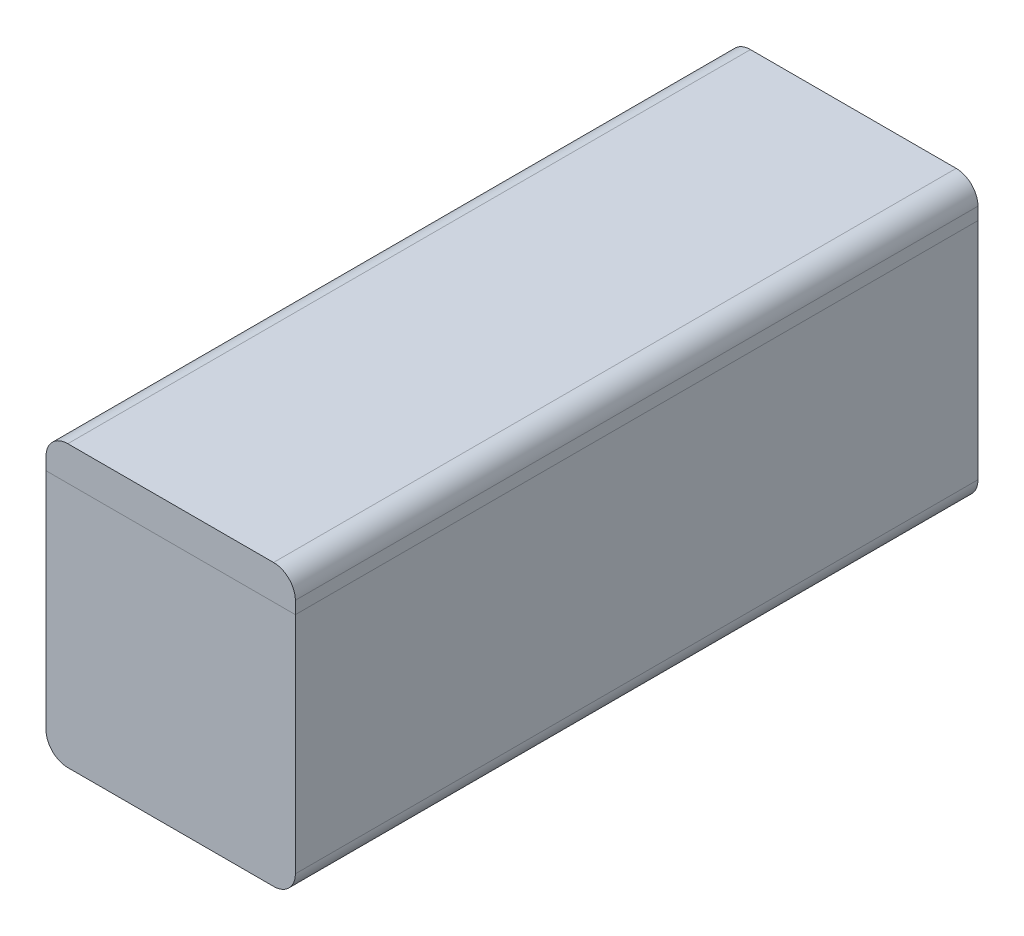
ISO-10303-21;
HEADER;
FILE_DESCRIPTION(('STEP AP214'),'2;1');
FILE_NAME('part.step','',(''),(''),'','','');
FILE_SCHEMA(('AUTOMOTIVE_DESIGN { 1 0 10303 214 1 1 1 1 }'));
ENDSEC;
DATA;
#1=APPLICATION_CONTEXT('core data for automotive mechanical design processes');
#2=APPLICATION_PROTOCOL_DEFINITION('international standard','automotive_design',2000,#1);
#3=PRODUCT_CONTEXT('',#1,'mechanical');
#4=PRODUCT('Part','Part','',(#3));
#5=PRODUCT_RELATED_PRODUCT_CATEGORY('part','',(#4));
#6=PRODUCT_DEFINITION_FORMATION('','',#4);
#7=PRODUCT_DEFINITION_CONTEXT('part definition',#1,'design');
#8=PRODUCT_DEFINITION('design','',#6,#7);
#9=PRODUCT_DEFINITION_SHAPE('','',#8);
#10=(LENGTH_UNIT() NAMED_UNIT(*) SI_UNIT(.MILLI.,.METRE.));
#11=(NAMED_UNIT(*) PLANE_ANGLE_UNIT() SI_UNIT($,.RADIAN.));
#12=(NAMED_UNIT(*) SI_UNIT($,.STERADIAN.) SOLID_ANGLE_UNIT());
#13=UNCERTAINTY_MEASURE_WITH_UNIT(LENGTH_MEASURE(1.E-05),#10,'distance_accuracy_value','');
#14=(GEOMETRIC_REPRESENTATION_CONTEXT(3) GLOBAL_UNCERTAINTY_ASSIGNED_CONTEXT((#13)) GLOBAL_UNIT_ASSIGNED_CONTEXT((#10,
#11,#12)) REPRESENTATION_CONTEXT('',''));
#15=CARTESIAN_POINT('',(0.,0.,0.));
#16=DIRECTION('',(0.,0.,1.));
#17=DIRECTION('',(1.,0.,0.));
#18=AXIS2_PLACEMENT_3D('',#15,#16,#17);
#19=CARTESIAN_POINT('',(0.,79.,-219.01));
#20=DIRECTION('',(0.,-1.,0.));
#21=DIRECTION('',(0.,0.,-1.));
#22=AXIS2_PLACEMENT_3D('',#19,#20,#21);
#23=PLANE('',#22);
#24=DIRECTION('',(0.,0.,-1.));
#25=VECTOR('',#24,1.);
#26=CARTESIAN_POINT('',(78.,79.,-219.));
#27=LINE('',#26,#25);
#28=CARTESIAN_POINT('',(78.,79.,-2.));
#29=VERTEX_POINT('',#28);
#30=CARTESIAN_POINT('',(78.,79.,-217.));
#31=VERTEX_POINT('',#30);
#32=EDGE_CURVE('E165',#29,#31,#27,.T.);
#33=ORIENTED_EDGE('',*,*,#32,.T.);
#34=DIRECTION('',(-1.,0.,0.));
#35=VECTOR('',#34,1.);
#36=CARTESIAN_POINT('',(73.,79.,-217.));
#37=LINE('',#36,#35);
#38=CARTESIAN_POINT('',(2.,79.,-217.));
#39=VERTEX_POINT('',#38);
#40=EDGE_CURVE('E151',#31,#39,#37,.T.);
#41=ORIENTED_EDGE('',*,*,#40,.T.);
#42=DIRECTION('',(0.,0.,1.));
#43=VECTOR('',#42,1.);
#44=CARTESIAN_POINT('',(2.,79.,-219.));
#45=LINE('',#44,#43);
#46=CARTESIAN_POINT('',(2.,79.,-2.));
#47=VERTEX_POINT('',#46);
#48=EDGE_CURVE('E160',#39,#47,#45,.T.);
#49=ORIENTED_EDGE('',*,*,#48,.T.);
#50=DIRECTION('',(-1.,0.,0.));
#51=VECTOR('',#50,1.);
#52=CARTESIAN_POINT('',(73.,79.,-2.));
#53=LINE('',#52,#51);
#54=EDGE_CURVE('E175',#29,#47,#53,.T.);
#55=ORIENTED_EDGE('',*,*,#54,.F.);
#56=EDGE_LOOP('',(#33,#41,#49,#55));
#57=FACE_BOUND('',#56,.T.);
#58=DIRECTION('',(-1.,0.,0.));
#59=VECTOR('',#58,1.);
#60=CARTESIAN_POINT('',(73.,79.,-219.));
#61=LINE('',#60,#59);
#62=CARTESIAN_POINT('',(80.,79.,-219.));
#63=VERTEX_POINT('',#62);
#64=CARTESIAN_POINT('',(0.,79.,-219.));
#65=VERTEX_POINT('',#64);
#66=EDGE_CURVE('E196',#63,#65,#61,.T.);
#67=ORIENTED_EDGE('',*,*,#66,.F.);
#68=DIRECTION('',(0.,0.,-1.));
#69=VECTOR('',#68,1.);
#70=CARTESIAN_POINT('',(80.,79.,-219.));
#71=LINE('',#70,#69);
#72=CARTESIAN_POINT('',(80.,79.,0.));
#73=VERTEX_POINT('',#72);
#74=EDGE_CURVE('E201',#73,#63,#71,.T.);
#75=ORIENTED_EDGE('',*,*,#74,.F.);
#76=DIRECTION('',(-1.,0.,0.));
#77=VECTOR('',#76,1.);
#78=CARTESIAN_POINT('',(73.,79.,0.));
#79=LINE('',#78,#77);
#80=CARTESIAN_POINT('',(0.,79.,0.));
#81=VERTEX_POINT('',#80);
#82=EDGE_CURVE('E204',#73,#81,#79,.T.);
#83=ORIENTED_EDGE('',*,*,#82,.T.);
#84=DIRECTION('',(0.,0.,1.));
#85=VECTOR('',#84,1.);
#86=CARTESIAN_POINT('',(0.,79.,-219.));
#87=LINE('',#86,#85);
#88=EDGE_CURVE('E198',#65,#81,#87,.T.);
#89=ORIENTED_EDGE('',*,*,#88,.F.);
#90=EDGE_LOOP('',(#67,#75,#83,#89));
#91=FACE_BOUND('',#90,.T.);
#92=ADVANCED_FACE('F46',(#57,#91),#23,.T.);
#93=CARTESIAN_POINT('',(73.,83.,-219.));
#94=DIRECTION('',(0.,0.,1.));
#95=DIRECTION('',(1.,0.,0.));
#96=AXIS2_PLACEMENT_3D('',#93,#94,#95);
#97=CYLINDRICAL_SURFACE('',#96,5.00000000000001);
#98=CARTESIAN_POINT('',(73.,83.,-2.));
#99=DIRECTION('',(0.,0.,-1.));
#100=DIRECTION('',(-1.,0.,0.));
#101=AXIS2_PLACEMENT_3D('',#98,#99,#100);
#102=CIRCLE('',#101,5.00000000000001);
#103=CARTESIAN_POINT('',(78.,83.,-2.));
#104=VERTEX_POINT('',#103);
#105=CARTESIAN_POINT('',(73.,88.,-2.));
#106=VERTEX_POINT('',#105);
#107=EDGE_CURVE('E233',#104,#106,#102,.F.);
#108=ORIENTED_EDGE('',*,*,#107,.T.);
#109=DIRECTION('',(0.,0.,1.));
#110=VECTOR('',#109,1.);
#111=CARTESIAN_POINT('',(73.,88.,-219.));
#112=LINE('',#111,#110);
#113=CARTESIAN_POINT('',(73.,88.,-217.));
#114=VERTEX_POINT('',#113);
#115=EDGE_CURVE('E180',#114,#106,#112,.T.);
#116=ORIENTED_EDGE('',*,*,#115,.F.);
#117=CARTESIAN_POINT('',(73.,83.,-217.));
#118=DIRECTION('',(0.,0.,-1.));
#119=DIRECTION('',(-1.,0.,0.));
#120=AXIS2_PLACEMENT_3D('',#117,#118,#119);
#121=CIRCLE('',#120,5.00000000000001);
#122=CARTESIAN_POINT('',(78.,83.,-217.));
#123=VERTEX_POINT('',#122);
#124=EDGE_CURVE('E224',#123,#114,#121,.F.);
#125=ORIENTED_EDGE('',*,*,#124,.F.);
#126=DIRECTION('',(0.,0.,-1.));
#127=VECTOR('',#126,1.);
#128=CARTESIAN_POINT('',(78.,83.,-219.));
#129=LINE('',#128,#127);
#130=EDGE_CURVE('E156',#123,#104,#129,.F.);
#131=ORIENTED_EDGE('',*,*,#130,.T.);
#132=EDGE_LOOP('',(#108,#116,#125,#131));
#133=FACE_BOUND('',#132,.T.);
#134=ADVANCED_FACE('F251',(#133),#97,.F.);
#135=CARTESIAN_POINT('',(7.,88.,-219.));
#136=DIRECTION('',(0.,1.,0.));
#137=DIRECTION('',(0.,0.,1.));
#138=AXIS2_PLACEMENT_3D('',#135,#136,#137);
#139=PLANE('',#138);
#140=DIRECTION('',(-1.,0.,0.));
#141=VECTOR('',#140,1.);
#142=CARTESIAN_POINT('',(7.,88.,-2.));
#143=LINE('',#142,#141);
#144=CARTESIAN_POINT('',(7.,88.,-2.));
#145=VERTEX_POINT('',#144);
#146=EDGE_CURVE('E230',#106,#145,#143,.T.);
#147=ORIENTED_EDGE('',*,*,#146,.T.);
#148=DIRECTION('',(0.,0.,1.));
#149=VECTOR('',#148,1.);
#150=CARTESIAN_POINT('',(7.,88.,-219.));
#151=LINE('',#150,#149);
#152=CARTESIAN_POINT('',(7.,88.,-217.));
#153=VERTEX_POINT('',#152);
#154=EDGE_CURVE('E236',#153,#145,#151,.T.);
#155=ORIENTED_EDGE('',*,*,#154,.F.);
#156=DIRECTION('',(-1.,0.,0.));
#157=VECTOR('',#156,1.);
#158=CARTESIAN_POINT('',(7.,88.,-217.));
#159=LINE('',#158,#157);
#160=EDGE_CURVE('E238',#114,#153,#159,.T.);
#161=ORIENTED_EDGE('',*,*,#160,.F.);
#162=ORIENTED_EDGE('',*,*,#115,.T.);
#163=EDGE_LOOP('',(#147,#155,#161,#162));
#164=FACE_BOUND('',#163,.T.);
#165=ADVANCED_FACE('F255',(#164),#139,.F.);
#166=CARTESIAN_POINT('',(7.,83.,-219.));
#167=DIRECTION('',(0.,0.,1.));
#168=DIRECTION('',(1.,0.,0.));
#169=AXIS2_PLACEMENT_3D('',#166,#167,#168);
#170=CYLINDRICAL_SURFACE('',#169,5.);
#171=CARTESIAN_POINT('',(7.,83.,-2.));
#172=DIRECTION('',(0.,0.,-1.));
#173=DIRECTION('',(-1.,0.,0.));
#174=AXIS2_PLACEMENT_3D('',#171,#172,#173);
#175=CIRCLE('',#174,5.);
#176=CARTESIAN_POINT('',(2.,83.,-2.));
#177=VERTEX_POINT('',#176);
#178=EDGE_CURVE('E176',#145,#177,#175,.F.);
#179=ORIENTED_EDGE('',*,*,#178,.T.);
#180=DIRECTION('',(0.,0.,1.));
#181=VECTOR('',#180,1.);
#182=CARTESIAN_POINT('',(2.,83.,-219.));
#183=LINE('',#182,#181);
#184=CARTESIAN_POINT('',(2.,83.,-217.));
#185=VERTEX_POINT('',#184);
#186=EDGE_CURVE('E240',#185,#177,#183,.T.);
#187=ORIENTED_EDGE('',*,*,#186,.F.);
#188=CARTESIAN_POINT('',(7.,83.,-217.));
#189=DIRECTION('',(0.,0.,-1.));
#190=DIRECTION('',(-1.,0.,0.));
#191=AXIS2_PLACEMENT_3D('',#188,#189,#190);
#192=CIRCLE('',#191,5.);
#193=EDGE_CURVE('E154',#153,#185,#192,.F.);
#194=ORIENTED_EDGE('',*,*,#193,.F.);
#195=ORIENTED_EDGE('',*,*,#154,.T.);
#196=EDGE_LOOP('',(#179,#187,#194,#195));
#197=FACE_BOUND('',#196,.T.);
#198=ADVANCED_FACE('F258',(#197),#170,.F.);
#199=CARTESIAN_POINT('',(2.,7.,-219.));
#200=DIRECTION('',(-1.,0.,0.));
#201=DIRECTION('',(0.,0.,1.));
#202=AXIS2_PLACEMENT_3D('',#199,#200,#201);
#203=PLANE('',#202);
#204=ORIENTED_EDGE('',*,*,#48,.F.);
#205=DIRECTION('',(0.,-1.,0.));
#206=VECTOR('',#205,1.);
#207=CARTESIAN_POINT('',(2.,7.,-217.));
#208=LINE('',#207,#206);
#209=EDGE_CURVE('E147',#185,#39,#208,.T.);
#210=ORIENTED_EDGE('',*,*,#209,.F.);
#211=ORIENTED_EDGE('',*,*,#186,.T.);
#212=DIRECTION('',(0.,-1.,0.));
#213=VECTOR('',#212,1.);
#214=CARTESIAN_POINT('',(2.,7.,-2.));
#215=LINE('',#214,#213);
#216=EDGE_CURVE('E163',#177,#47,#215,.T.);
#217=ORIENTED_EDGE('',*,*,#216,.T.);
#218=EDGE_LOOP('',(#204,#210,#211,#217));
#219=FACE_BOUND('',#218,.T.);
#220=ADVANCED_FACE('F161',(#219),#203,.F.);
#221=CARTESIAN_POINT('',(78.,7.,-219.));
#222=DIRECTION('',(1.,0.,0.));
#223=DIRECTION('',(0.,0.,-1.));
#224=AXIS2_PLACEMENT_3D('',#221,#222,#223);
#225=PLANE('',#224);
#226=ORIENTED_EDGE('',*,*,#32,.F.);
#227=DIRECTION('',(0.,1.,0.));
#228=VECTOR('',#227,1.);
#229=CARTESIAN_POINT('',(78.,7.,-2.));
#230=LINE('',#229,#228);
#231=EDGE_CURVE('E173',#29,#104,#230,.T.);
#232=ORIENTED_EDGE('',*,*,#231,.T.);
#233=ORIENTED_EDGE('',*,*,#130,.F.);
#234=DIRECTION('',(0.,1.,0.));
#235=VECTOR('',#234,1.);
#236=CARTESIAN_POINT('',(78.,7.,-217.));
#237=LINE('',#236,#235);
#238=EDGE_CURVE('E178',#31,#123,#237,.T.);
#239=ORIENTED_EDGE('',*,*,#238,.F.);
#240=EDGE_LOOP('',(#226,#232,#233,#239));
#241=FACE_BOUND('',#240,.T.);
#242=ADVANCED_FACE('F263',(#241),#225,.F.);
#243=CARTESIAN_POINT('',(73.,83.,-2.));
#244=DIRECTION('',(0.,0.,-1.));
#245=DIRECTION('',(-1.,0.,0.));
#246=AXIS2_PLACEMENT_3D('',#243,#244,#245);
#247=PLANE('',#246);
#248=ORIENTED_EDGE('',*,*,#231,.F.);
#249=ORIENTED_EDGE('',*,*,#54,.T.);
#250=ORIENTED_EDGE('',*,*,#216,.F.);
#251=ORIENTED_EDGE('',*,*,#178,.F.);
#252=ORIENTED_EDGE('',*,*,#146,.F.);
#253=ORIENTED_EDGE('',*,*,#107,.F.);
#254=EDGE_LOOP('',(#248,#249,#250,#251,#252,#253));
#255=FACE_BOUND('',#254,.T.);
#256=ADVANCED_FACE('F261',(#255),#247,.T.);
#257=CARTESIAN_POINT('',(73.,83.,-217.));
#258=DIRECTION('',(0.,0.,-1.));
#259=DIRECTION('',(-1.,0.,0.));
#260=AXIS2_PLACEMENT_3D('',#257,#258,#259);
#261=PLANE('',#260);
#262=ORIENTED_EDGE('',*,*,#40,.F.);
#263=ORIENTED_EDGE('',*,*,#238,.T.);
#264=ORIENTED_EDGE('',*,*,#124,.T.);
#265=ORIENTED_EDGE('',*,*,#160,.T.);
#266=ORIENTED_EDGE('',*,*,#193,.T.);
#267=ORIENTED_EDGE('',*,*,#209,.T.);
#268=EDGE_LOOP('',(#262,#263,#264,#265,#266,#267));
#269=FACE_BOUND('',#268,.T.);
#270=ADVANCED_FACE('F149',(#269),#261,.F.);
#271=CARTESIAN_POINT('',(80.,7.,-219.));
#272=DIRECTION('',(1.,0.,0.));
#273=DIRECTION('',(0.,0.,-1.));
#274=AXIS2_PLACEMENT_3D('',#271,#272,#273);
#275=PLANE('',#274);
#276=DIRECTION('',(0.,1.,0.));
#277=VECTOR('',#276,1.);
#278=CARTESIAN_POINT('',(80.,7.,0.));
#279=LINE('',#278,#277);
#280=CARTESIAN_POINT('',(80.,83.,0.));
#281=VERTEX_POINT('',#280);
#282=EDGE_CURVE('E94',#73,#281,#279,.T.);
#283=ORIENTED_EDGE('',*,*,#282,.F.);
#284=ORIENTED_EDGE('',*,*,#74,.T.);
#285=DIRECTION('',(0.,1.,0.));
#286=VECTOR('',#285,1.);
#287=CARTESIAN_POINT('',(80.,7.,-219.));
#288=LINE('',#287,#286);
#289=CARTESIAN_POINT('',(80.,83.,-219.));
#290=VERTEX_POINT('',#289);
#291=EDGE_CURVE('E181',#63,#290,#288,.T.);
#292=ORIENTED_EDGE('',*,*,#291,.T.);
#293=DIRECTION('',(0.,0.,1.));
#294=VECTOR('',#293,1.);
#295=CARTESIAN_POINT('',(80.,83.,-219.));
#296=LINE('',#295,#294);
#297=EDGE_CURVE('E222',#290,#281,#296,.T.);
#298=ORIENTED_EDGE('',*,*,#297,.T.);
#299=EDGE_LOOP('',(#283,#284,#292,#298));
#300=FACE_BOUND('',#299,.T.);
#301=ADVANCED_FACE('F349',(#300),#275,.T.);
#302=CARTESIAN_POINT('',(0.,7.,-219.));
#303=DIRECTION('',(-1.,0.,0.));
#304=DIRECTION('',(0.,0.,1.));
#305=AXIS2_PLACEMENT_3D('',#302,#303,#304);
#306=PLANE('',#305);
#307=DIRECTION('',(0.,-1.,0.));
#308=VECTOR('',#307,1.);
#309=CARTESIAN_POINT('',(0.,7.,-219.));
#310=LINE('',#309,#308);
#311=CARTESIAN_POINT('',(0.,83.,-219.));
#312=VERTEX_POINT('',#311);
#313=EDGE_CURVE('E183',#312,#65,#310,.T.);
#314=ORIENTED_EDGE('',*,*,#313,.T.);
#315=ORIENTED_EDGE('',*,*,#88,.T.);
#316=DIRECTION('',(0.,-1.,0.));
#317=VECTOR('',#316,1.);
#318=CARTESIAN_POINT('',(0.,7.,0.));
#319=LINE('',#318,#317);
#320=CARTESIAN_POINT('',(0.,83.,0.));
#321=VERTEX_POINT('',#320);
#322=EDGE_CURVE('E50',#321,#81,#319,.T.);
#323=ORIENTED_EDGE('',*,*,#322,.F.);
#324=DIRECTION('',(0.,0.,1.));
#325=VECTOR('',#324,1.);
#326=CARTESIAN_POINT('',(0.,83.,-219.));
#327=LINE('',#326,#325);
#328=EDGE_CURVE('E215',#312,#321,#327,.T.);
#329=ORIENTED_EDGE('',*,*,#328,.F.);
#330=EDGE_LOOP('',(#314,#315,#323,#329));
#331=FACE_BOUND('',#330,.T.);
#332=ADVANCED_FACE('F213',(#331),#306,.T.);
#333=CARTESIAN_POINT('',(73.,83.,-219.));
#334=DIRECTION('',(0.,0.,-1.));
#335=DIRECTION('',(-1.,0.,0.));
#336=AXIS2_PLACEMENT_3D('',#333,#334,#335);
#337=PLANE('',#336);
#338=ORIENTED_EDGE('',*,*,#291,.F.);
#339=ORIENTED_EDGE('',*,*,#66,.T.);
#340=ORIENTED_EDGE('',*,*,#313,.F.);
#341=CARTESIAN_POINT('',(7.,83.,-219.));
#342=DIRECTION('',(0.,0.,1.));
#343=DIRECTION('',(-1.,0.,0.));
#344=AXIS2_PLACEMENT_3D('',#341,#342,#343);
#345=CIRCLE('',#344,7.);
#346=CARTESIAN_POINT('',(7.,90.,-219.));
#347=VERTEX_POINT('',#346);
#348=EDGE_CURVE('E185',#347,#312,#345,.T.);
#349=ORIENTED_EDGE('',*,*,#348,.F.);
#350=DIRECTION('',(-1.,0.,0.));
#351=VECTOR('',#350,1.);
#352=CARTESIAN_POINT('',(7.,90.,-219.));
#353=LINE('',#352,#351);
#354=CARTESIAN_POINT('',(73.,90.,-219.));
#355=VERTEX_POINT('',#354);
#356=EDGE_CURVE('E188',#355,#347,#353,.T.);
#357=ORIENTED_EDGE('',*,*,#356,.F.);
#358=CARTESIAN_POINT('',(73.,83.,-219.));
#359=DIRECTION('',(0.,0.,1.));
#360=DIRECTION('',(-1.,0.,0.));
#361=AXIS2_PLACEMENT_3D('',#358,#359,#360);
#362=CIRCLE('',#361,7.00000000000001);
#363=EDGE_CURVE('E186',#290,#355,#362,.T.);
#364=ORIENTED_EDGE('',*,*,#363,.F.);
#365=EDGE_LOOP('',(#338,#339,#340,#349,#357,#364));
#366=FACE_BOUND('',#365,.T.);
#367=ADVANCED_FACE('F48',(#366),#337,.T.);
#368=CARTESIAN_POINT('',(73.,83.,0.));
#369=DIRECTION('',(0.,0.,-1.));
#370=DIRECTION('',(-1.,0.,0.));
#371=AXIS2_PLACEMENT_3D('',#368,#369,#370);
#372=PLANE('',#371);
#373=ORIENTED_EDGE('',*,*,#82,.F.);
#374=ORIENTED_EDGE('',*,*,#282,.T.);
#375=CARTESIAN_POINT('',(73.,83.,0.));
#376=DIRECTION('',(0.,0.,1.));
#377=DIRECTION('',(-1.,0.,0.));
#378=AXIS2_PLACEMENT_3D('',#375,#376,#377);
#379=CIRCLE('',#378,7.00000000000001);
#380=CARTESIAN_POINT('',(73.,90.,0.));
#381=VERTEX_POINT('',#380);
#382=EDGE_CURVE('E12',#281,#381,#379,.T.);
#383=ORIENTED_EDGE('',*,*,#382,.T.);
#384=DIRECTION('',(-1.,0.,0.));
#385=VECTOR('',#384,1.);
#386=CARTESIAN_POINT('',(7.,90.,0.));
#387=LINE('',#386,#385);
#388=CARTESIAN_POINT('',(7.,90.,0.));
#389=VERTEX_POINT('',#388);
#390=EDGE_CURVE('E56',#381,#389,#387,.T.);
#391=ORIENTED_EDGE('',*,*,#390,.T.);
#392=CARTESIAN_POINT('',(7.,83.,0.));
#393=DIRECTION('',(0.,0.,1.));
#394=DIRECTION('',(-1.,0.,0.));
#395=AXIS2_PLACEMENT_3D('',#392,#393,#394);
#396=CIRCLE('',#395,7.);
#397=EDGE_CURVE('E187',#389,#321,#396,.T.);
#398=ORIENTED_EDGE('',*,*,#397,.T.);
#399=ORIENTED_EDGE('',*,*,#322,.T.);
#400=EDGE_LOOP('',(#373,#374,#383,#391,#398,#399));
#401=FACE_BOUND('',#400,.T.);
#402=ADVANCED_FACE('F208',(#401),#372,.F.);
#403=CARTESIAN_POINT('',(73.,83.,-219.));
#404=DIRECTION('',(0.,0.,1.));
#405=DIRECTION('',(1.,0.,0.));
#406=AXIS2_PLACEMENT_3D('',#403,#404,#405);
#407=CYLINDRICAL_SURFACE('',#406,7.00000000000001);
#408=ORIENTED_EDGE('',*,*,#382,.F.);
#409=ORIENTED_EDGE('',*,*,#297,.F.);
#410=ORIENTED_EDGE('',*,*,#363,.T.);
#411=DIRECTION('',(0.,0.,1.));
#412=VECTOR('',#411,1.);
#413=CARTESIAN_POINT('',(73.,90.,-219.));
#414=LINE('',#413,#412);
#415=EDGE_CURVE('E65',#355,#381,#414,.T.);
#416=ORIENTED_EDGE('',*,*,#415,.T.);
#417=EDGE_LOOP('',(#408,#409,#410,#416));
#418=FACE_BOUND('',#417,.T.);
#419=ADVANCED_FACE('F283',(#418),#407,.T.);
#420=CARTESIAN_POINT('',(7.,83.,-219.));
#421=DIRECTION('',(0.,0.,1.));
#422=DIRECTION('',(1.,0.,0.));
#423=AXIS2_PLACEMENT_3D('',#420,#421,#422);
#424=CYLINDRICAL_SURFACE('',#423,7.);
#425=ORIENTED_EDGE('',*,*,#397,.F.);
#426=DIRECTION('',(0.,0.,1.));
#427=VECTOR('',#426,1.);
#428=CARTESIAN_POINT('',(7.,90.,-219.));
#429=LINE('',#428,#427);
#430=EDGE_CURVE('E83',#347,#389,#429,.T.);
#431=ORIENTED_EDGE('',*,*,#430,.F.);
#432=ORIENTED_EDGE('',*,*,#348,.T.);
#433=ORIENTED_EDGE('',*,*,#328,.T.);
#434=EDGE_LOOP('',(#425,#431,#432,#433));
#435=FACE_BOUND('',#434,.T.);
#436=ADVANCED_FACE('F218',(#435),#424,.T.);
#437=CARTESIAN_POINT('',(7.,90.,-219.));
#438=DIRECTION('',(0.,1.,0.));
#439=DIRECTION('',(0.,0.,1.));
#440=AXIS2_PLACEMENT_3D('',#437,#438,#439);
#441=PLANE('',#440);
#442=ORIENTED_EDGE('',*,*,#390,.F.);
#443=ORIENTED_EDGE('',*,*,#415,.F.);
#444=ORIENTED_EDGE('',*,*,#356,.T.);
#445=ORIENTED_EDGE('',*,*,#430,.T.);
#446=EDGE_LOOP('',(#442,#443,#444,#445));
#447=FACE_BOUND('',#446,.T.);
#448=ADVANCED_FACE('F280',(#447),#441,.T.);
#449=CLOSED_SHELL('',(#92,#134,#165,#198,#220,#242,#256,#270,#301,#332,#367,#402,#419,#436,#448));
#450=MANIFOLD_SOLID_BREP('B2',#449);
#451=CARTESIAN_POINT('',(0.,79.,-219.01));
#452=DIRECTION('',(0.,-1.,0.));
#453=DIRECTION('',(0.,0.,-1.));
#454=AXIS2_PLACEMENT_3D('',#451,#452,#453);
#455=PLANE('',#454);
#456=DIRECTION('',(-1.,0.,0.));
#457=VECTOR('',#456,1.);
#458=CARTESIAN_POINT('',(73.,79.,-219.));
#459=LINE('',#458,#457);
#460=CARTESIAN_POINT('',(80.,79.,-219.));
#461=VERTEX_POINT('',#460);
#462=CARTESIAN_POINT('',(0.,79.,-219.));
#463=VERTEX_POINT('',#462);
#464=EDGE_CURVE('E391',#461,#463,#459,.T.);
#465=ORIENTED_EDGE('',*,*,#464,.T.);
#466=DIRECTION('',(0.,0.,1.));
#467=VECTOR('',#466,1.);
#468=CARTESIAN_POINT('',(0.,79.,-219.));
#469=LINE('',#468,#467);
#470=CARTESIAN_POINT('',(0.,79.,0.));
#471=VERTEX_POINT('',#470);
#472=EDGE_CURVE('E484',#463,#471,#469,.T.);
#473=ORIENTED_EDGE('',*,*,#472,.T.);
#474=DIRECTION('',(-1.,0.,0.));
#475=VECTOR('',#474,1.);
#476=CARTESIAN_POINT('',(73.,79.,0.));
#477=LINE('',#476,#475);
#478=CARTESIAN_POINT('',(80.,79.,0.));
#479=VERTEX_POINT('',#478);
#480=EDGE_CURVE('E567',#479,#471,#477,.T.);
#481=ORIENTED_EDGE('',*,*,#480,.F.);
#482=DIRECTION('',(0.,0.,-1.));
#483=VECTOR('',#482,1.);
#484=CARTESIAN_POINT('',(80.,79.,-219.));
#485=LINE('',#484,#483);
#486=EDGE_CURVE('E569',#479,#461,#485,.T.);
#487=ORIENTED_EDGE('',*,*,#486,.T.);
#488=EDGE_LOOP('',(#465,#473,#481,#487));
#489=FACE_BOUND('',#488,.T.);
#490=DIRECTION('',(0.,0.,-1.));
#491=VECTOR('',#490,1.);
#492=CARTESIAN_POINT('',(78.,79.,-219.));
#493=LINE('',#492,#491);
#494=CARTESIAN_POINT('',(78.,79.,-2.));
#495=VERTEX_POINT('',#494);
#496=CARTESIAN_POINT('',(78.,79.,-217.));
#497=VERTEX_POINT('',#496);
#498=EDGE_CURVE('E570',#495,#497,#493,.T.);
#499=ORIENTED_EDGE('',*,*,#498,.F.);
#500=DIRECTION('',(-1.,0.,0.));
#501=VECTOR('',#500,1.);
#502=CARTESIAN_POINT('',(73.,79.,-2.));
#503=LINE('',#502,#501);
#504=CARTESIAN_POINT('',(2.,79.,-2.));
#505=VERTEX_POINT('',#504);
#506=EDGE_CURVE('E44',#495,#505,#503,.T.);
#507=ORIENTED_EDGE('',*,*,#506,.T.);
#508=DIRECTION('',(0.,0.,1.));
#509=VECTOR('',#508,1.);
#510=CARTESIAN_POINT('',(2.,79.,-219.));
#511=LINE('',#510,#509);
#512=CARTESIAN_POINT('',(2.,79.,-217.));
#513=VERTEX_POINT('',#512);
#514=EDGE_CURVE('E409',#513,#505,#511,.T.);
#515=ORIENTED_EDGE('',*,*,#514,.F.);
#516=DIRECTION('',(-1.,0.,0.));
#517=VECTOR('',#516,1.);
#518=CARTESIAN_POINT('',(73.,79.,-217.));
#519=LINE('',#518,#517);
#520=EDGE_CURVE('E533',#497,#513,#519,.T.);
#521=ORIENTED_EDGE('',*,*,#520,.F.);
#522=EDGE_LOOP('',(#499,#507,#515,#521));
#523=FACE_BOUND('',#522,.T.);
#524=ADVANCED_FACE('F388',(#489,#523),#455,.F.);
#525=CARTESIAN_POINT('',(78.,7.,-219.));
#526=DIRECTION('',(1.,0.,0.));
#527=DIRECTION('',(0.,0.,-1.));
#528=AXIS2_PLACEMENT_3D('',#525,#526,#527);
#529=PLANE('',#528);
#530=DIRECTION('',(0.,1.,0.));
#531=VECTOR('',#530,1.);
#532=CARTESIAN_POINT('',(78.,7.,-2.));
#533=LINE('',#532,#531);
#534=CARTESIAN_POINT('',(78.,7.,-2.));
#535=VERTEX_POINT('',#534);
#536=EDGE_CURVE('E530',#535,#495,#533,.T.);
#537=ORIENTED_EDGE('',*,*,#536,.T.);
#538=ORIENTED_EDGE('',*,*,#498,.T.);
#539=DIRECTION('',(0.,1.,0.));
#540=VECTOR('',#539,1.);
#541=CARTESIAN_POINT('',(78.,7.,-217.));
#542=LINE('',#541,#540);
#543=CARTESIAN_POINT('',(78.,7.,-217.));
#544=VERTEX_POINT('',#543);
#545=EDGE_CURVE('E526',#544,#497,#542,.T.);
#546=ORIENTED_EDGE('',*,*,#545,.F.);
#547=DIRECTION('',(0.,0.,1.));
#548=VECTOR('',#547,1.);
#549=CARTESIAN_POINT('',(78.,7.,-219.));
#550=LINE('',#549,#548);
#551=EDGE_CURVE('E560',#544,#535,#550,.T.);
#552=ORIENTED_EDGE('',*,*,#551,.T.);
#553=EDGE_LOOP('',(#537,#538,#546,#552));
#554=FACE_BOUND('',#553,.T.);
#555=ADVANCED_FACE('F594',(#554),#529,.F.);
#556=CARTESIAN_POINT('',(73.,7.,-219.));
#557=DIRECTION('',(0.,0.,1.));
#558=DIRECTION('',(1.,0.,0.));
#559=AXIS2_PLACEMENT_3D('',#556,#557,#558);
#560=CYLINDRICAL_SURFACE('',#559,5.);
#561=CARTESIAN_POINT('',(73.,7.,-2.));
#562=DIRECTION('',(0.,0.,-1.));
#563=DIRECTION('',(-1.,0.,0.));
#564=AXIS2_PLACEMENT_3D('',#561,#562,#563);
#565=CIRCLE('',#564,5.);
#566=CARTESIAN_POINT('',(73.,2.,-2.));
#567=VERTEX_POINT('',#566);
#568=EDGE_CURVE('E534',#567,#535,#565,.F.);
#569=ORIENTED_EDGE('',*,*,#568,.T.);
#570=ORIENTED_EDGE('',*,*,#551,.F.);
#571=CARTESIAN_POINT('',(73.,7.,-217.));
#572=DIRECTION('',(0.,0.,-1.));
#573=DIRECTION('',(-1.,0.,0.));
#574=AXIS2_PLACEMENT_3D('',#571,#572,#573);
#575=CIRCLE('',#574,5.);
#576=CARTESIAN_POINT('',(73.,2.,-217.));
#577=VERTEX_POINT('',#576);
#578=EDGE_CURVE('E562',#577,#544,#575,.F.);
#579=ORIENTED_EDGE('',*,*,#578,.F.);
#580=DIRECTION('',(0.,0.,-1.));
#581=VECTOR('',#580,1.);
#582=CARTESIAN_POINT('',(73.,2.,-219.));
#583=LINE('',#582,#581);
#584=EDGE_CURVE('E555',#577,#567,#583,.F.);
#585=ORIENTED_EDGE('',*,*,#584,.T.);
#586=EDGE_LOOP('',(#569,#570,#579,#585));
#587=FACE_BOUND('',#586,.T.);
#588=ADVANCED_FACE('F592',(#587),#560,.F.);
#589=CARTESIAN_POINT('',(7.,2.,-219.));
#590=DIRECTION('',(0.,-1.,0.));
#591=DIRECTION('',(0.,0.,-1.));
#592=AXIS2_PLACEMENT_3D('',#589,#590,#591);
#593=PLANE('',#592);
#594=DIRECTION('',(1.,0.,0.));
#595=VECTOR('',#594,1.);
#596=CARTESIAN_POINT('',(7.,2.,-2.));
#597=LINE('',#596,#595);
#598=CARTESIAN_POINT('',(7.,2.,-2.));
#599=VERTEX_POINT('',#598);
#600=EDGE_CURVE('E537',#599,#567,#597,.T.);
#601=ORIENTED_EDGE('',*,*,#600,.T.);
#602=ORIENTED_EDGE('',*,*,#584,.F.);
#603=DIRECTION('',(1.,0.,0.));
#604=VECTOR('',#603,1.);
#605=CARTESIAN_POINT('',(7.,2.,-217.));
#606=LINE('',#605,#604);
#607=CARTESIAN_POINT('',(7.,2.,-217.));
#608=VERTEX_POINT('',#607);
#609=EDGE_CURVE('E557',#608,#577,#606,.T.);
#610=ORIENTED_EDGE('',*,*,#609,.F.);
#611=DIRECTION('',(0.,0.,1.));
#612=VECTOR('',#611,1.);
#613=CARTESIAN_POINT('',(7.,2.,-219.));
#614=LINE('',#613,#612);
#615=EDGE_CURVE('E550',#608,#599,#614,.T.);
#616=ORIENTED_EDGE('',*,*,#615,.T.);
#617=EDGE_LOOP('',(#601,#602,#610,#616));
#618=FACE_BOUND('',#617,.T.);
#619=ADVANCED_FACE('F588',(#618),#593,.F.);
#620=CARTESIAN_POINT('',(7.,7.,-219.));
#621=DIRECTION('',(0.,0.,1.));
#622=DIRECTION('',(1.,0.,0.));
#623=AXIS2_PLACEMENT_3D('',#620,#621,#622);
#624=CYLINDRICAL_SURFACE('',#623,5.);
#625=CARTESIAN_POINT('',(7.,7.,-2.));
#626=DIRECTION('',(0.,0.,-1.));
#627=DIRECTION('',(-1.,0.,0.));
#628=AXIS2_PLACEMENT_3D('',#625,#626,#627);
#629=CIRCLE('',#628,5.);
#630=CARTESIAN_POINT('',(2.,7.,-2.));
#631=VERTEX_POINT('',#630);
#632=EDGE_CURVE('E540',#631,#599,#629,.F.);
#633=ORIENTED_EDGE('',*,*,#632,.T.);
#634=ORIENTED_EDGE('',*,*,#615,.F.);
#635=CARTESIAN_POINT('',(7.,7.,-217.));
#636=DIRECTION('',(0.,0.,-1.));
#637=DIRECTION('',(-1.,0.,0.));
#638=AXIS2_PLACEMENT_3D('',#635,#636,#637);
#639=CIRCLE('',#638,5.);
#640=CARTESIAN_POINT('',(2.,7.,-217.));
#641=VERTEX_POINT('',#640);
#642=EDGE_CURVE('E552',#641,#608,#639,.F.);
#643=ORIENTED_EDGE('',*,*,#642,.F.);
#644=DIRECTION('',(0.,0.,1.));
#645=VECTOR('',#644,1.);
#646=CARTESIAN_POINT('',(2.,7.,-219.));
#647=LINE('',#646,#645);
#648=EDGE_CURVE('E545',#641,#631,#647,.T.);
#649=ORIENTED_EDGE('',*,*,#648,.T.);
#650=EDGE_LOOP('',(#633,#634,#643,#649));
#651=FACE_BOUND('',#650,.T.);
#652=ADVANCED_FACE('F584',(#651),#624,.F.);
#653=CARTESIAN_POINT('',(2.,7.,-219.));
#654=DIRECTION('',(-1.,0.,0.));
#655=DIRECTION('',(0.,0.,1.));
#656=AXIS2_PLACEMENT_3D('',#653,#654,#655);
#657=PLANE('',#656);
#658=DIRECTION('',(0.,-1.,0.));
#659=VECTOR('',#658,1.);
#660=CARTESIAN_POINT('',(2.,7.,-217.));
#661=LINE('',#660,#659);
#662=EDGE_CURVE('E548',#513,#641,#661,.T.);
#663=ORIENTED_EDGE('',*,*,#662,.F.);
#664=ORIENTED_EDGE('',*,*,#514,.T.);
#665=DIRECTION('',(0.,-1.,0.));
#666=VECTOR('',#665,1.);
#667=CARTESIAN_POINT('',(2.,7.,-2.));
#668=LINE('',#667,#666);
#669=EDGE_CURVE('E543',#505,#631,#668,.T.);
#670=ORIENTED_EDGE('',*,*,#669,.T.);
#671=ORIENTED_EDGE('',*,*,#648,.F.);
#672=EDGE_LOOP('',(#663,#664,#670,#671));
#673=FACE_BOUND('',#672,.T.);
#674=ADVANCED_FACE('F580',(#673),#657,.F.);
#675=CARTESIAN_POINT('',(73.,83.,-217.));
#676=DIRECTION('',(0.,0.,-1.));
#677=DIRECTION('',(-1.,0.,0.));
#678=AXIS2_PLACEMENT_3D('',#675,#676,#677);
#679=PLANE('',#678);
#680=ORIENTED_EDGE('',*,*,#545,.T.);
#681=ORIENTED_EDGE('',*,*,#520,.T.);
#682=ORIENTED_EDGE('',*,*,#662,.T.);
#683=ORIENTED_EDGE('',*,*,#642,.T.);
#684=ORIENTED_EDGE('',*,*,#609,.T.);
#685=ORIENTED_EDGE('',*,*,#578,.T.);
#686=EDGE_LOOP('',(#680,#681,#682,#683,#684,#685));
#687=FACE_BOUND('',#686,.T.);
#688=ADVANCED_FACE('F576',(#687),#679,.F.);
#689=CARTESIAN_POINT('',(73.,83.,-2.));
#690=DIRECTION('',(0.,0.,-1.));
#691=DIRECTION('',(-1.,0.,0.));
#692=AXIS2_PLACEMENT_3D('',#689,#690,#691);
#693=PLANE('',#692);
#694=ORIENTED_EDGE('',*,*,#506,.F.);
#695=ORIENTED_EDGE('',*,*,#536,.F.);
#696=ORIENTED_EDGE('',*,*,#568,.F.);
#697=ORIENTED_EDGE('',*,*,#600,.F.);
#698=ORIENTED_EDGE('',*,*,#632,.F.);
#699=ORIENTED_EDGE('',*,*,#669,.F.);
#700=EDGE_LOOP('',(#694,#695,#696,#697,#698,#699));
#701=FACE_BOUND('',#700,.T.);
#702=ADVANCED_FACE('F595',(#701),#693,.T.);
#703=CARTESIAN_POINT('',(73.,7.,-219.));
#704=DIRECTION('',(0.,0.,1.));
#705=DIRECTION('',(1.,0.,0.));
#706=AXIS2_PLACEMENT_3D('',#703,#704,#705);
#707=CYLINDRICAL_SURFACE('',#706,7.);
#708=CARTESIAN_POINT('',(73.,7.,0.));
#709=DIRECTION('',(0.,0.,1.));
#710=DIRECTION('',(1.,0.,0.));
#711=AXIS2_PLACEMENT_3D('',#708,#709,#710);
#712=CIRCLE('',#711,7.);
#713=CARTESIAN_POINT('',(73.,0.,0.));
#714=VERTEX_POINT('',#713);
#715=CARTESIAN_POINT('',(80.,7.,0.));
#716=VERTEX_POINT('',#715);
#717=EDGE_CURVE('E519',#714,#716,#712,.T.);
#718=ORIENTED_EDGE('',*,*,#717,.F.);
#719=DIRECTION('',(0.,0.,1.));
#720=VECTOR('',#719,1.);
#721=CARTESIAN_POINT('',(73.,0.,-219.));
#722=LINE('',#721,#720);
#723=CARTESIAN_POINT('',(73.,0.,-219.));
#724=VERTEX_POINT('',#723);
#725=EDGE_CURVE('E527',#724,#714,#722,.T.);
#726=ORIENTED_EDGE('',*,*,#725,.F.);
#727=CARTESIAN_POINT('',(73.,7.,-219.));
#728=DIRECTION('',(0.,0.,1.));
#729=DIRECTION('',(1.,0.,0.));
#730=AXIS2_PLACEMENT_3D('',#727,#728,#729);
#731=CIRCLE('',#730,7.);
#732=CARTESIAN_POINT('',(80.,7.,-219.));
#733=VERTEX_POINT('',#732);
#734=EDGE_CURVE('E506',#724,#733,#731,.T.);
#735=ORIENTED_EDGE('',*,*,#734,.T.);
#736=DIRECTION('',(0.,0.,1.));
#737=VECTOR('',#736,1.);
#738=CARTESIAN_POINT('',(80.,7.,-219.));
#739=LINE('',#738,#737);
#740=EDGE_CURVE('E524',#733,#716,#739,.T.);
#741=ORIENTED_EDGE('',*,*,#740,.T.);
#742=EDGE_LOOP('',(#718,#726,#735,#741));
#743=FACE_BOUND('',#742,.T.);
#744=ADVANCED_FACE('F597',(#743),#707,.T.);
#745=CARTESIAN_POINT('',(7.,0.,-219.));
#746=DIRECTION('',(0.,-1.,0.));
#747=DIRECTION('',(0.,0.,-1.));
#748=AXIS2_PLACEMENT_3D('',#745,#746,#747);
#749=PLANE('',#748);
#750=DIRECTION('',(1.,0.,0.));
#751=VECTOR('',#750,1.);
#752=CARTESIAN_POINT('',(7.,0.,0.));
#753=LINE('',#752,#751);
#754=CARTESIAN_POINT('',(7.,0.,0.));
#755=VERTEX_POINT('',#754);
#756=EDGE_CURVE('E516',#755,#714,#753,.T.);
#757=ORIENTED_EDGE('',*,*,#756,.F.);
#758=DIRECTION('',(0.,0.,1.));
#759=VECTOR('',#758,1.);
#760=CARTESIAN_POINT('',(7.,0.,-219.));
#761=LINE('',#760,#759);
#762=CARTESIAN_POINT('',(7.,0.,-219.));
#763=VERTEX_POINT('',#762);
#764=EDGE_CURVE('E497',#763,#755,#761,.T.);
#765=ORIENTED_EDGE('',*,*,#764,.F.);
#766=DIRECTION('',(1.,0.,0.));
#767=VECTOR('',#766,1.);
#768=CARTESIAN_POINT('',(7.,0.,-219.));
#769=LINE('',#768,#767);
#770=EDGE_CURVE('E504',#763,#724,#769,.T.);
#771=ORIENTED_EDGE('',*,*,#770,.T.);
#772=ORIENTED_EDGE('',*,*,#725,.T.);
#773=EDGE_LOOP('',(#757,#765,#771,#772));
#774=FACE_BOUND('',#773,.T.);
#775=ADVANCED_FACE('F602',(#774),#749,.T.);
#776=CARTESIAN_POINT('',(7.,7.,-219.));
#777=DIRECTION('',(0.,0.,1.));
#778=DIRECTION('',(1.,0.,0.));
#779=AXIS2_PLACEMENT_3D('',#776,#777,#778);
#780=CYLINDRICAL_SURFACE('',#779,7.);
#781=CARTESIAN_POINT('',(7.,7.,0.));
#782=DIRECTION('',(0.,0.,1.));
#783=DIRECTION('',(-1.,0.,0.));
#784=AXIS2_PLACEMENT_3D('',#781,#782,#783);
#785=CIRCLE('',#784,7.);
#786=CARTESIAN_POINT('',(0.,7.,0.));
#787=VERTEX_POINT('',#786);
#788=EDGE_CURVE('E496',#787,#755,#785,.T.);
#789=ORIENTED_EDGE('',*,*,#788,.F.);
#790=DIRECTION('',(0.,0.,1.));
#791=VECTOR('',#790,1.);
#792=CARTESIAN_POINT('',(0.,7.,-219.));
#793=LINE('',#792,#791);
#794=CARTESIAN_POINT('',(0.,7.,-219.));
#795=VERTEX_POINT('',#794);
#796=EDGE_CURVE('E481',#795,#787,#793,.T.);
#797=ORIENTED_EDGE('',*,*,#796,.F.);
#798=CARTESIAN_POINT('',(7.,7.,-219.));
#799=DIRECTION('',(0.,0.,1.));
#800=DIRECTION('',(-1.,0.,0.));
#801=AXIS2_PLACEMENT_3D('',#798,#799,#800);
#802=CIRCLE('',#801,7.);
#803=EDGE_CURVE('E489',#795,#763,#802,.T.);
#804=ORIENTED_EDGE('',*,*,#803,.T.);
#805=ORIENTED_EDGE('',*,*,#764,.T.);
#806=EDGE_LOOP('',(#789,#797,#804,#805));
#807=FACE_BOUND('',#806,.T.);
#808=ADVANCED_FACE('F494',(#807),#780,.T.);
#809=CARTESIAN_POINT('',(0.,7.,-219.));
#810=DIRECTION('',(-1.,0.,0.));
#811=DIRECTION('',(0.,0.,1.));
#812=AXIS2_PLACEMENT_3D('',#809,#810,#811);
#813=PLANE('',#812);
#814=ORIENTED_EDGE('',*,*,#472,.F.);
#815=DIRECTION('',(0.,-1.,0.));
#816=VECTOR('',#815,1.);
#817=CARTESIAN_POINT('',(0.,7.,-219.));
#818=LINE('',#817,#816);
#819=EDGE_CURVE('E477',#463,#795,#818,.T.);
#820=ORIENTED_EDGE('',*,*,#819,.T.);
#821=ORIENTED_EDGE('',*,*,#796,.T.);
#822=DIRECTION('',(0.,-1.,0.));
#823=VECTOR('',#822,1.);
#824=CARTESIAN_POINT('',(0.,7.,0.));
#825=LINE('',#824,#823);
#826=EDGE_CURVE('E513',#471,#787,#825,.T.);
#827=ORIENTED_EDGE('',*,*,#826,.F.);
#828=EDGE_LOOP('',(#814,#820,#821,#827));
#829=FACE_BOUND('',#828,.T.);
#830=ADVANCED_FACE('F479',(#829),#813,.T.);
#831=CARTESIAN_POINT('',(80.,7.,-219.));
#832=DIRECTION('',(1.,0.,0.));
#833=DIRECTION('',(0.,0.,-1.));
#834=AXIS2_PLACEMENT_3D('',#831,#832,#833);
#835=PLANE('',#834);
#836=ORIENTED_EDGE('',*,*,#486,.F.);
#837=DIRECTION('',(0.,1.,0.));
#838=VECTOR('',#837,1.);
#839=CARTESIAN_POINT('',(80.,7.,0.));
#840=LINE('',#839,#838);
#841=EDGE_CURVE('E490',#716,#479,#840,.T.);
#842=ORIENTED_EDGE('',*,*,#841,.F.);
#843=ORIENTED_EDGE('',*,*,#740,.F.);
#844=DIRECTION('',(0.,1.,0.));
#845=VECTOR('',#844,1.);
#846=CARTESIAN_POINT('',(80.,7.,-219.));
#847=LINE('',#846,#845);
#848=EDGE_CURVE('E498',#733,#461,#847,.T.);
#849=ORIENTED_EDGE('',*,*,#848,.T.);
#850=EDGE_LOOP('',(#836,#842,#843,#849));
#851=FACE_BOUND('',#850,.T.);
#852=ADVANCED_FACE('F618',(#851),#835,.T.);
#853=CARTESIAN_POINT('',(73.,83.,0.));
#854=DIRECTION('',(0.,0.,-1.));
#855=DIRECTION('',(-1.,0.,0.));
#856=AXIS2_PLACEMENT_3D('',#853,#854,#855);
#857=PLANE('',#856);
#858=ORIENTED_EDGE('',*,*,#841,.T.);
#859=ORIENTED_EDGE('',*,*,#480,.T.);
#860=ORIENTED_EDGE('',*,*,#826,.T.);
#861=ORIENTED_EDGE('',*,*,#788,.T.);
#862=ORIENTED_EDGE('',*,*,#756,.T.);
#863=ORIENTED_EDGE('',*,*,#717,.T.);
#864=EDGE_LOOP('',(#858,#859,#860,#861,#862,#863));
#865=FACE_BOUND('',#864,.T.);
#866=ADVANCED_FACE('F613',(#865),#857,.F.);
#867=CARTESIAN_POINT('',(73.,83.,-219.));
#868=DIRECTION('',(0.,0.,-1.));
#869=DIRECTION('',(-1.,0.,0.));
#870=AXIS2_PLACEMENT_3D('',#867,#868,#869);
#871=PLANE('',#870);
#872=ORIENTED_EDGE('',*,*,#464,.F.);
#873=ORIENTED_EDGE('',*,*,#848,.F.);
#874=ORIENTED_EDGE('',*,*,#734,.F.);
#875=ORIENTED_EDGE('',*,*,#770,.F.);
#876=ORIENTED_EDGE('',*,*,#803,.F.);
#877=ORIENTED_EDGE('',*,*,#819,.F.);
#878=EDGE_LOOP('',(#872,#873,#874,#875,#876,#877));
#879=FACE_BOUND('',#878,.T.);
#880=ADVANCED_FACE('F501',(#879),#871,.T.);
#881=CLOSED_SHELL('',(#524,#555,#588,#619,#652,#674,#688,#702,#744,#775,#808,#830,#852,#866,#880));
#882=MANIFOLD_SOLID_BREP('B6',#881);
#883=ADVANCED_BREP_SHAPE_REPRESENTATION('',(#18,#450,#882),#14);
#884=SHAPE_DEFINITION_REPRESENTATION(#9,#883);
ENDSEC;
END-ISO-10303-21;
